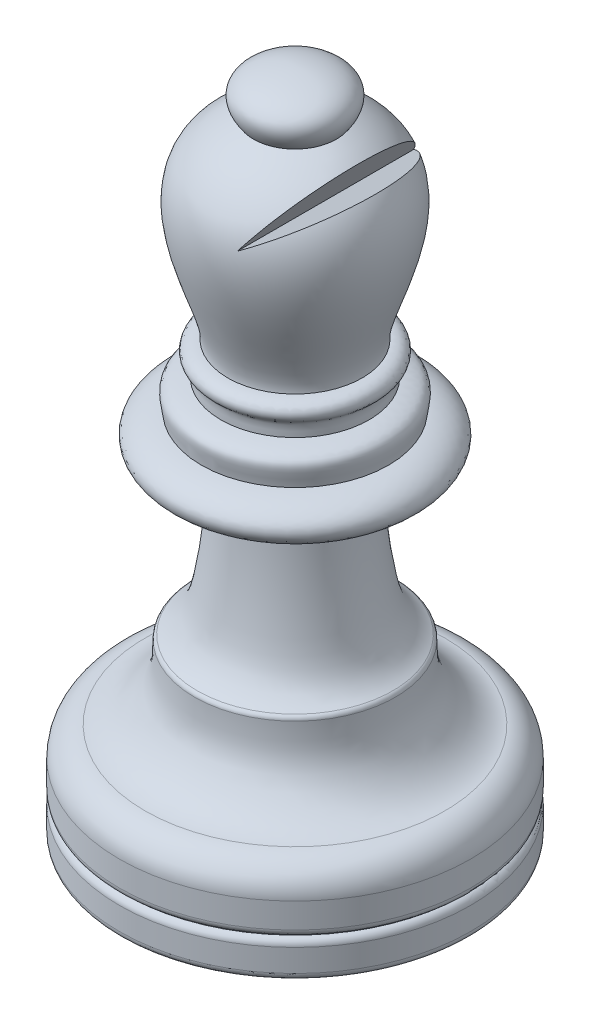
ISO-10303-21;
HEADER;
FILE_DESCRIPTION(('STEP AP214'),'2;1');
FILE_NAME('part.step','',(''),(''),'','','');
FILE_SCHEMA(('AUTOMOTIVE_DESIGN { 1 0 10303 214 1 1 1 1 }'));
ENDSEC;
DATA;
#1=APPLICATION_CONTEXT('core data for automotive mechanical design processes');
#2=APPLICATION_PROTOCOL_DEFINITION('international standard','automotive_design',2000,#1);
#3=PRODUCT_CONTEXT('',#1,'mechanical');
#4=PRODUCT('Part','Part','',(#3));
#5=PRODUCT_RELATED_PRODUCT_CATEGORY('part','',(#4));
#6=PRODUCT_DEFINITION_FORMATION('','',#4);
#7=PRODUCT_DEFINITION_CONTEXT('part definition',#1,'design');
#8=PRODUCT_DEFINITION('design','',#6,#7);
#9=PRODUCT_DEFINITION_SHAPE('','',#8);
#10=(LENGTH_UNIT() NAMED_UNIT(*) SI_UNIT(.MILLI.,.METRE.));
#11=(NAMED_UNIT(*) PLANE_ANGLE_UNIT() SI_UNIT($,.RADIAN.));
#12=(NAMED_UNIT(*) SI_UNIT($,.STERADIAN.) SOLID_ANGLE_UNIT());
#13=UNCERTAINTY_MEASURE_WITH_UNIT(LENGTH_MEASURE(1.E-05),#10,'distance_accuracy_value','');
#14=(GEOMETRIC_REPRESENTATION_CONTEXT(3) GLOBAL_UNCERTAINTY_ASSIGNED_CONTEXT((#13)) GLOBAL_UNIT_ASSIGNED_CONTEXT((#10,
#11,#12)) REPRESENTATION_CONTEXT('',''));
#15=CARTESIAN_POINT('',(0.,0.,0.));
#16=DIRECTION('',(0.,0.,1.));
#17=DIRECTION('',(1.,0.,0.));
#18=AXIS2_PLACEMENT_3D('',#15,#16,#17);
#19=CARTESIAN_POINT('',(0.,0.,0.));
#20=DIRECTION('',(0.,1.,0.));
#21=DIRECTION('',(0.,0.,1.));
#22=AXIS2_PLACEMENT_3D('',#19,#20,#21);
#23=PLANE('',#22);
#24=CARTESIAN_POINT('',(0.,0.,0.));
#25=DIRECTION('',(0.,-1.,0.));
#26=DIRECTION('',(0.,0.,-1.));
#27=AXIS2_PLACEMENT_3D('',#24,#25,#26);
#28=CIRCLE('',#27,17.018);
#29=CARTESIAN_POINT('',(0.,0.,-17.018));
#30=VERTEX_POINT('',#29);
#31=EDGE_CURVE('E61',#30,#30,#28,.T.);
#32=ORIENTED_EDGE('',*,*,#31,.T.);
#33=EDGE_LOOP('',(#32));
#34=FACE_BOUND('',#33,.T.);
#35=ADVANCED_FACE('F34',(#34),#23,.F.);
#36=CARTESIAN_POINT('',(0.,0.761999999999975,0.));
#37=DIRECTION('',(0.,-1.,0.));
#38=DIRECTION('',(0.,0.,-1.));
#39=AXIS2_PLACEMENT_3D('',#36,#37,#38);
#40=TOROIDAL_SURFACE('',#39,17.018,0.762000000000006);
#41=ORIENTED_EDGE('',*,*,#31,.F.);
#42=EDGE_LOOP('',(#41));
#43=FACE_BOUND('',#42,.T.);
#44=CARTESIAN_POINT('',(0.,0.761999999999975,0.));
#45=DIRECTION('',(0.,-1.,0.));
#46=DIRECTION('',(0.,0.,-1.));
#47=AXIS2_PLACEMENT_3D('',#44,#45,#46);
#48=CIRCLE('',#47,17.78);
#49=CARTESIAN_POINT('',(0.,0.761999999999975,-17.78));
#50=VERTEX_POINT('',#49);
#51=EDGE_CURVE('E115',#50,#50,#48,.T.);
#52=ORIENTED_EDGE('',*,*,#51,.T.);
#53=EDGE_LOOP('',(#52));
#54=FACE_BOUND('',#53,.T.);
#55=ADVANCED_FACE('F217',(#43,#54),#40,.T.);
#56=CARTESIAN_POINT('',(0.,0.,0.));
#57=DIRECTION('',(0.,-1.,0.));
#58=DIRECTION('',(0.,0.,-1.));
#59=AXIS2_PLACEMENT_3D('',#56,#57,#58);
#60=CYLINDRICAL_SURFACE('',#59,17.78);
#61=ORIENTED_EDGE('',*,*,#51,.F.);
#62=EDGE_LOOP('',(#61));
#63=FACE_BOUND('',#62,.T.);
#64=CARTESIAN_POINT('',(0.,3.048,0.));
#65=DIRECTION('',(0.,-1.,0.));
#66=DIRECTION('',(0.,0.,-1.));
#67=AXIS2_PLACEMENT_3D('',#64,#65,#66);
#68=CIRCLE('',#67,17.78);
#69=CARTESIAN_POINT('',(0.,3.048,-17.78));
#70=VERTEX_POINT('',#69);
#71=EDGE_CURVE('E112',#70,#70,#68,.T.);
#72=ORIENTED_EDGE('',*,*,#71,.T.);
#73=EDGE_LOOP('',(#72));
#74=FACE_BOUND('',#73,.T.);
#75=ADVANCED_FACE('F214',(#63,#74),#60,.T.);
#76=CARTESIAN_POINT('',(0.,3.048,0.));
#77=DIRECTION('',(0.,-1.,0.));
#78=DIRECTION('',(0.,0.,-1.));
#79=AXIS2_PLACEMENT_3D('',#76,#77,#78);
#80=TOROIDAL_SURFACE('',#79,17.018,0.762000000000006);
#81=ORIENTED_EDGE('',*,*,#71,.F.);
#82=EDGE_LOOP('',(#81));
#83=FACE_BOUND('',#82,.T.);
#84=CARTESIAN_POINT('',(0.,3.76642048968553,0.));
#85=DIRECTION('',(0.,-1.,0.));
#86=DIRECTION('',(0.,0.,-1.));
#87=AXIS2_PLACEMENT_3D('',#84,#85,#86);
#88=CIRCLE('',#87,17.272);
#89=CARTESIAN_POINT('',(0.,3.76642048968553,-17.272));
#90=VERTEX_POINT('',#89);
#91=EDGE_CURVE('E109',#90,#90,#88,.T.);
#92=ORIENTED_EDGE('',*,*,#91,.T.);
#93=EDGE_LOOP('',(#92));
#94=FACE_BOUND('',#93,.T.);
#95=ADVANCED_FACE('F210',(#83,#94),#80,.T.);
#96=CARTESIAN_POINT('',(0.,0.,0.));
#97=DIRECTION('',(0.,-1.,0.));
#98=DIRECTION('',(0.,0.,-1.));
#99=AXIS2_PLACEMENT_3D('',#96,#97,#98);
#100=CYLINDRICAL_SURFACE('',#99,17.272);
#101=ORIENTED_EDGE('',*,*,#91,.F.);
#102=EDGE_LOOP('',(#101));
#103=FACE_BOUND('',#102,.T.);
#104=CARTESIAN_POINT('',(0.,3.85357951031446,0.));
#105=DIRECTION('',(0.,-1.,0.));
#106=DIRECTION('',(0.,0.,-1.));
#107=AXIS2_PLACEMENT_3D('',#104,#105,#106);
#108=CIRCLE('',#107,17.272);
#109=CARTESIAN_POINT('',(0.,3.85357951031446,-17.272));
#110=VERTEX_POINT('',#109);
#111=EDGE_CURVE('E106',#110,#110,#108,.T.);
#112=ORIENTED_EDGE('',*,*,#111,.T.);
#113=EDGE_LOOP('',(#112));
#114=FACE_BOUND('',#113,.T.);
#115=ADVANCED_FACE('F206',(#103,#114),#100,.T.);
#116=CARTESIAN_POINT('',(0.,4.572,0.));
#117=DIRECTION('',(0.,-1.,0.));
#118=DIRECTION('',(0.,0.,-1.));
#119=AXIS2_PLACEMENT_3D('',#116,#117,#118);
#120=TOROIDAL_SURFACE('',#119,17.018,0.762000000000006);
#121=ORIENTED_EDGE('',*,*,#111,.F.);
#122=EDGE_LOOP('',(#121));
#123=FACE_BOUND('',#122,.T.);
#124=CARTESIAN_POINT('',(0.,4.572,0.));
#125=DIRECTION('',(0.,-1.,0.));
#126=DIRECTION('',(0.,0.,-1.));
#127=AXIS2_PLACEMENT_3D('',#124,#125,#126);
#128=CIRCLE('',#127,17.78);
#129=CARTESIAN_POINT('',(0.,4.572,-17.78));
#130=VERTEX_POINT('',#129);
#131=EDGE_CURVE('E103',#130,#130,#128,.T.);
#132=ORIENTED_EDGE('',*,*,#131,.T.);
#133=EDGE_LOOP('',(#132));
#134=FACE_BOUND('',#133,.T.);
#135=ADVANCED_FACE('F202',(#123,#134),#120,.T.);
#136=CARTESIAN_POINT('',(0.,0.,0.));
#137=DIRECTION('',(0.,-1.,0.));
#138=DIRECTION('',(0.,0.,-1.));
#139=AXIS2_PLACEMENT_3D('',#136,#137,#138);
#140=CYLINDRICAL_SURFACE('',#139,17.78);
#141=ORIENTED_EDGE('',*,*,#131,.F.);
#142=EDGE_LOOP('',(#141));
#143=FACE_BOUND('',#142,.T.);
#144=CARTESIAN_POINT('',(0.,7.112,0.));
#145=DIRECTION('',(0.,-1.,0.));
#146=DIRECTION('',(0.,0.,-1.));
#147=AXIS2_PLACEMENT_3D('',#144,#145,#146);
#148=CIRCLE('',#147,17.78);
#149=CARTESIAN_POINT('',(0.,7.112,-17.78));
#150=VERTEX_POINT('',#149);
#151=EDGE_CURVE('E100',#150,#150,#148,.T.);
#152=ORIENTED_EDGE('',*,*,#151,.T.);
#153=EDGE_LOOP('',(#152));
#154=FACE_BOUND('',#153,.T.);
#155=ADVANCED_FACE('F198',(#143,#154),#140,.T.);
#156=CARTESIAN_POINT('',(0.,7.112,0.));
#157=DIRECTION('',(0.,-1.,0.));
#158=DIRECTION('',(0.,0.,-1.));
#159=AXIS2_PLACEMENT_3D('',#156,#157,#158);
#160=TOROIDAL_SURFACE('',#159,14.8377650975335,2.94223490246648);
#161=ORIENTED_EDGE('',*,*,#151,.F.);
#162=EDGE_LOOP('',(#161));
#163=FACE_BOUND('',#162,.T.);
#164=CARTESIAN_POINT('',(0.,10.0349260723206,0.));
#165=DIRECTION('',(0.,1.,0.));
#166=DIRECTION('',(0.,0.,1.));
#167=AXIS2_PLACEMENT_3D('',#164,#165,#166);
#168=CIRCLE('',#167,15.1742905750839);
#169=CARTESIAN_POINT('',(0.,10.0349260723206,15.1742905750839));
#170=VERTEX_POINT('',#169);
#171=EDGE_CURVE('E64',#170,#170,#168,.T.);
#172=ORIENTED_EDGE('',*,*,#171,.F.);
#173=EDGE_LOOP('',(#172));
#174=FACE_BOUND('',#173,.T.);
#175=ADVANCED_FACE('F194',(#163,#174),#160,.T.);
#176=CARTESIAN_POINT('',(-10.1658072062689,17.5050188004564,0.));
#177=CARTESIAN_POINT('',(-10.1809672803453,15.59489943262,0.));
#178=CARTESIAN_POINT('',(-10.3592727653847,13.0901704590535,0.));
#179=CARTESIAN_POINT('',(-13.3160882163974,10.2488666307438,0.));
#180=CARTESIAN_POINT('',(-15.1742905750839,10.0349260723206,0.));
#181=B_SPLINE_CURVE_WITH_KNOTS('',3,(#176,#177,#178,#179,#180),.UNSPECIFIED.,.F.,.F.,(4,1,4),
(0.,0.437710418900928,0.976644515068052),.UNSPECIFIED.);
#182=CARTESIAN_POINT('',(0.,67.6698781179495,0.));
#183=DIRECTION('',(0.,1.,0.));
#184=AXIS1_PLACEMENT('',#182,#183);
#185=SURFACE_OF_REVOLUTION('',#181,#184);
#186=ORIENTED_EDGE('',*,*,#171,.T.);
#187=EDGE_LOOP('',(#186));
#188=FACE_BOUND('',#187,.T.);
#189=CARTESIAN_POINT('',(0.,17.5050188004564,0.));
#190=DIRECTION('',(0.,1.,0.));
#191=DIRECTION('',(0.,0.,1.));
#192=AXIS2_PLACEMENT_3D('',#189,#190,#191);
#193=CIRCLE('',#192,10.1658072062689);
#194=CARTESIAN_POINT('',(0.,17.5050188004564,10.1658072062689));
#195=VERTEX_POINT('',#194);
#196=EDGE_CURVE('E97',#195,#195,#193,.T.);
#197=ORIENTED_EDGE('',*,*,#196,.F.);
#198=EDGE_LOOP('',(#197));
#199=FACE_BOUND('',#198,.T.);
#200=ADVANCED_FACE('F190',(#188,#199),#185,.F.);
#201=CARTESIAN_POINT('',(0.,17.5009870759405,0.));
#202=DIRECTION('',(0.,1.,0.));
#203=DIRECTION('',(0.,0.,1.));
#204=AXIS2_PLACEMENT_3D('',#201,#202,#203);
#205=TOROIDAL_SURFACE('',#204,9.65782320534226,0.508);
#206=ORIENTED_EDGE('',*,*,#196,.T.);
#207=EDGE_LOOP('',(#206));
#208=FACE_BOUND('',#207,.T.);
#209=CARTESIAN_POINT('',(0.,17.9425825955284,0.));
#210=DIRECTION('',(0.,1.,0.));
#211=DIRECTION('',(0.,0.,1.));
#212=AXIS2_PLACEMENT_3D('',#209,#210,#211);
#213=CIRCLE('',#212,9.90893552499204);
#214=CARTESIAN_POINT('',(0.,17.9425825955284,9.90893552499204));
#215=VERTEX_POINT('',#214);
#216=EDGE_CURVE('E94',#215,#215,#213,.T.);
#217=ORIENTED_EDGE('',*,*,#216,.F.);
#218=EDGE_LOOP('',(#217));
#219=FACE_BOUND('',#218,.T.);
#220=ADVANCED_FACE('F186',(#208,#219),#205,.T.);
#221=CARTESIAN_POINT('',(-6.33561093892401,32.8495308731566,0.));
#222=CARTESIAN_POINT('',(-6.335610938924,28.9384637251122,0.));
#223=CARTESIAN_POINT('',(-7.20170632713195,22.0084679292815,0.));
#224=CARTESIAN_POINT('',(-8.18723618731335,18.9216231320525,0.));
#225=CARTESIAN_POINT('',(-9.90893552499204,17.9425825955284,0.));
#226=B_SPLINE_CURVE_WITH_KNOTS('',3,(#221,#222,#223,#224,#225),.UNSPECIFIED.,.F.,.F.,(4,1,4),
(0.0340636564472049,0.517031828223599,1.),.UNSPECIFIED.);
#227=CARTESIAN_POINT('',(0.,67.6698781179495,0.));
#228=DIRECTION('',(0.,1.,0.));
#229=AXIS1_PLACEMENT('',#227,#228);
#230=SURFACE_OF_REVOLUTION('',#226,#229);
#231=ORIENTED_EDGE('',*,*,#216,.T.);
#232=EDGE_LOOP('',(#231));
#233=FACE_BOUND('',#232,.T.);
#234=CARTESIAN_POINT('',(0.,32.8495308731565,0.));
#235=DIRECTION('',(0.,1.,0.));
#236=DIRECTION('',(0.,0.,1.));
#237=AXIS2_PLACEMENT_3D('',#234,#235,#236);
#238=CIRCLE('',#237,6.33561093892401);
#239=CARTESIAN_POINT('',(0.,32.8495308731565,6.33561093892401));
#240=VERTEX_POINT('',#239);
#241=EDGE_CURVE('E91',#240,#240,#238,.T.);
#242=ORIENTED_EDGE('',*,*,#241,.F.);
#243=EDGE_LOOP('',(#242));
#244=FACE_BOUND('',#243,.T.);
#245=ADVANCED_FACE('F170',(#233,#244),#230,.F.);
#246=CARTESIAN_POINT('',(-9.47679987893514,37.5095441929416,0.));
#247=CARTESIAN_POINT('',(-13.5515715372785,37.1082659605497,0.));
#248=CARTESIAN_POINT('',(-14.7005135325093,33.3538368824988,0.));
#249=CARTESIAN_POINT('',(-6.33561093892401,32.8495308731565,0.));
#250=B_SPLINE_CURVE_WITH_KNOTS('',3,(#246,#247,#248,#249),.UNSPECIFIED.,.F.,.F.,(4,4),(0.,1.),.UNSPECIFIED.);
#251=CARTESIAN_POINT('',(0.,67.6698781179495,0.));
#252=DIRECTION('',(0.,1.,0.));
#253=AXIS1_PLACEMENT('',#251,#252);
#254=SURFACE_OF_REVOLUTION('',#250,#253);
#255=ORIENTED_EDGE('',*,*,#241,.T.);
#256=EDGE_LOOP('',(#255));
#257=FACE_BOUND('',#256,.T.);
#258=CARTESIAN_POINT('',(0.,37.5095441929416,0.));
#259=DIRECTION('',(0.,1.,0.));
#260=DIRECTION('',(0.,0.,1.));
#261=AXIS2_PLACEMENT_3D('',#258,#259,#260);
#262=CIRCLE('',#261,9.47679987893517);
#263=CARTESIAN_POINT('',(0.,37.5095441929416,9.47679987893517));
#264=VERTEX_POINT('',#263);
#265=EDGE_CURVE('E88',#264,#264,#262,.T.);
#266=ORIENTED_EDGE('',*,*,#265,.F.);
#267=EDGE_LOOP('',(#266));
#268=FACE_BOUND('',#267,.T.);
#269=ADVANCED_FACE('F166',(#257,#268),#254,.F.);
#270=CARTESIAN_POINT('',(-7.50256352380719,40.495892352194,0.));
#271=CARTESIAN_POINT('',(-10.409099173475,40.1261014526597,0.));
#272=CARTESIAN_POINT('',(-9.65886315654239,39.31118182096,0.));
#273=CARTESIAN_POINT('',(-9.47679987893517,37.5095441929416,0.));
#274=B_SPLINE_CURVE_WITH_KNOTS('',3,(#270,#271,#272,#273),.UNSPECIFIED.,.F.,.F.,(4,4),(0.,1.),.UNSPECIFIED.);
#275=CARTESIAN_POINT('',(0.,67.6698781179495,0.));
#276=DIRECTION('',(0.,1.,0.));
#277=AXIS1_PLACEMENT('',#275,#276);
#278=SURFACE_OF_REVOLUTION('',#274,#277);
#279=ORIENTED_EDGE('',*,*,#265,.T.);
#280=EDGE_LOOP('',(#279));
#281=FACE_BOUND('',#280,.T.);
#282=CARTESIAN_POINT('',(0.,40.495892352194,0.));
#283=DIRECTION('',(0.,1.,0.));
#284=DIRECTION('',(0.,0.,1.));
#285=AXIS2_PLACEMENT_3D('',#282,#283,#284);
#286=CIRCLE('',#285,7.50256352380719);
#287=CARTESIAN_POINT('',(0.,40.495892352194,7.50256352380719));
#288=VERTEX_POINT('',#287);
#289=EDGE_CURVE('E80',#288,#288,#286,.T.);
#290=ORIENTED_EDGE('',*,*,#289,.F.);
#291=EDGE_LOOP('',(#290));
#292=FACE_BOUND('',#291,.T.);
#293=ADVANCED_FACE('F162',(#281,#292),#278,.F.);
#294=CARTESIAN_POINT('',(-6.80398712890876,43.8222789138501,0.));
#295=CARTESIAN_POINT('',(-8.34292458633681,43.8222789138501,0.));
#296=CARTESIAN_POINT('',(-8.57815167741565,42.5722983479072,0.));
#297=CARTESIAN_POINT('',(-7.45016531967225,41.873203308927,0.));
#298=CARTESIAN_POINT('',(-7.50256352380719,41.2489996545864,0.));
#299=CARTESIAN_POINT('',(-7.50256352380719,40.495892352194,0.));
#300=B_SPLINE_CURVE_WITH_KNOTS('',3,(#294,#295,#296,#297,#298,#299),.UNSPECIFIED.,.F.,.F.,(4,1,
1,4),(0.,0.575411721932043,0.675411721932043,1.),.UNSPECIFIED.);
#301=CARTESIAN_POINT('',(0.,67.6698781179495,0.));
#302=DIRECTION('',(0.,1.,0.));
#303=AXIS1_PLACEMENT('',#301,#302);
#304=SURFACE_OF_REVOLUTION('',#300,#303);
#305=ORIENTED_EDGE('',*,*,#289,.T.);
#306=EDGE_LOOP('',(#305));
#307=FACE_BOUND('',#306,.T.);
#308=CARTESIAN_POINT('',(0.,43.8222789138501,0.));
#309=DIRECTION('',(0.,1.,0.));
#310=DIRECTION('',(0.,0.,1.));
#311=AXIS2_PLACEMENT_3D('',#308,#309,#310);
#312=CIRCLE('',#311,6.80398712890876);
#313=CARTESIAN_POINT('',(0.,43.8222789138501,6.80398712890876));
#314=VERTEX_POINT('',#313);
#315=EDGE_CURVE('E74',#314,#314,#312,.T.);
#316=ORIENTED_EDGE('',*,*,#315,.F.);
#317=EDGE_LOOP('',(#316));
#318=FACE_BOUND('',#317,.T.);
#319=ADVANCED_FACE('F70',(#307,#318),#304,.F.);
#320=CARTESIAN_POINT('',(-4.20185587861461,63.4648150169811,0.));
#321=CARTESIAN_POINT('',(-14.9075575344491,58.9286477823746,0.));
#322=CARTESIAN_POINT('',(-6.28085600979704,47.5213361669619,0.));
#323=CARTESIAN_POINT('',(-6.80398712890876,43.8222789138501,0.));
#324=B_SPLINE_CURVE_WITH_KNOTS('',3,(#320,#321,#322,#323),.UNSPECIFIED.,.F.,.F.,(4,4),(0.,1.),.UNSPECIFIED.);
#325=CARTESIAN_POINT('',(0.,67.6698781179495,0.));
#326=DIRECTION('',(0.,1.,0.));
#327=AXIS1_PLACEMENT('',#325,#326);
#328=SURFACE_OF_REVOLUTION('',#324,#327);
#329=CARTESIAN_POINT('',(3.09599411827797,57.5573296947912,8.9388490998024));
#330=CARTESIAN_POINT('',(3.24978801906795,57.6502305790248,8.86807176976207));
#331=CARTESIAN_POINT('',(3.40166705936675,57.7419747708804,8.79160569343443));
#332=CARTESIAN_POINT('',(3.7009739986164,57.9227743940819,8.6275769313474));
#333=CARTESIAN_POINT('',(3.84840177817235,58.0118297533061,8.54001394826565));
#334=CARTESIAN_POINT('',(4.13817724978761,58.1868717894595,8.35407557641473));
#335=CARTESIAN_POINT('',(4.2805249143436,58.272858449775,8.25570012911952));
#336=CARTESIAN_POINT('',(4.55899185220129,58.4410694426941,8.0489283588191));
#337=CARTESIAN_POINT('',(4.69513355899365,58.5233073264926,7.94057326391947));
#338=CARTESIAN_POINT('',(4.96122382212537,58.6840420539681,7.71396181201206));
#339=CARTESIAN_POINT('',(5.09117291415201,58.7625392212329,7.59570631387956));
#340=CARTESIAN_POINT('',(5.3443567969643,58.91547770882,7.34981746554812));
#341=CARTESIAN_POINT('',(5.46759251867344,58.9899195914768,7.22218542136168));
#342=CARTESIAN_POINT('',(5.74615210680223,59.1581865508033,6.91477117778077));
#343=CARTESIAN_POINT('',(5.89875612539199,59.2503686737078,6.73160619716693));
#344=CARTESIAN_POINT('',(6.19042138648552,59.4265522578201,6.35109193585592));
#345=CARTESIAN_POINT('',(6.32948072087358,59.5105525664099,6.15374066344273));
#346=CARTESIAN_POINT('',(6.59326700698449,59.669895551421,5.74639081289797));
#347=CARTESIAN_POINT('',(6.71799471310848,59.7452386835467,5.53639290135928));
#348=CARTESIAN_POINT('',(6.9525080339383,59.8868990144033,5.10530589248278));
#349=CARTESIAN_POINT('',(7.06229315350929,59.9532159140426,4.88421642794934));
#350=CARTESIAN_POINT('',(7.26907710854067,60.0781260188585,4.42669526147947));
#351=CARTESIAN_POINT('',(7.36567270131773,60.1364756408914,4.19001483633924));
#352=CARTESIAN_POINT('',(7.54227550064466,60.2431544892158,3.70827230708183));
#353=CARTESIAN_POINT('',(7.62227704770012,60.2914802968279,3.46320737646863));
#354=CARTESIAN_POINT('',(7.76537449565557,60.3779198719889,2.96641609751791));
#355=CARTESIAN_POINT('',(7.82847007585708,60.4160334458162,2.71468962291344));
#356=CARTESIAN_POINT('',(7.937576009894,60.4819400760212,2.20619726649259));
#357=CARTESIAN_POINT('',(7.98357978492897,60.5097291584027,1.94942948418207));
#358=CARTESIAN_POINT('',(8.09997438800318,60.5800385886861,1.1444133113384));
#359=CARTESIAN_POINT('',(8.1405044447068,60.6045212117711,0.589878661083574));
#360=CARTESIAN_POINT('',(8.14379127243938,60.6065066559344,-0.519628074600037));
#361=CARTESIAN_POINT('',(8.10652718035503,60.5839968744215,-1.0746002374631));
#362=CARTESIAN_POINT('',(7.99166318000055,60.5146120214155,-1.90396230868258));
#363=CARTESIAN_POINT('',(7.94234882417061,60.4848231465741,-2.18403526342709));
#364=CARTESIAN_POINT('',(7.82340977176324,60.4129767139016,-2.738191390318));
#365=CARTESIAN_POINT('',(7.75379302949472,60.3709239609577,-3.01227686319044));
#366=CARTESIAN_POINT('',(7.59448871349209,60.2746944502759,-3.55241087585767));
#367=CARTESIAN_POINT('',(7.50479778667275,60.2205156670703,-3.81845806454404));
#368=CARTESIAN_POINT('',(7.30577290988534,60.1002925181479,-4.34020371940926));
#369=CARTESIAN_POINT('',(7.19644790479969,60.034253555685,-4.59590683340816));
#370=CARTESIAN_POINT('',(6.96180068689767,59.8925123428407,-5.08830187138104));
#371=CARTESIAN_POINT('',(6.83697575062029,59.8171104777797,-5.32531715990702));
#372=CARTESIAN_POINT('',(6.56985812510782,59.6557551608458,-5.78552862554353));
#373=CARTESIAN_POINT('',(6.4275653650952,59.5698016662189,-6.00872474665492));
#374=CARTESIAN_POINT('',(6.12644567462928,59.3879070308613,-6.43921447518004));
#375=CARTESIAN_POINT('',(5.9676245820768,59.2919694165783,-6.64651365285293));
#376=CARTESIAN_POINT('',(5.63451731195171,59.0907523346246,-7.04337836274786));
#377=CARTESIAN_POINT('',(5.46023279122337,58.9854738677887,-7.23294579039542));
#378=CARTESIAN_POINT('',(5.11665617955845,58.7779326658185,-7.57365505833842));
#379=CARTESIAN_POINT('',(4.94877309140983,58.6765210541957,-7.72674106642203));
#380=CARTESIAN_POINT('',(4.60280019827762,58.4675323522529,-8.01625220350759));
#381=CARTESIAN_POINT('',(4.42471106670023,58.3599556687113,-8.15267842988525));
#382=CARTESIAN_POINT('',(4.05925701265125,58.139199158905,-8.4081439187394));
#383=CARTESIAN_POINT('',(3.87187842500059,58.0260110780399,-8.52715648382024));
#384=CARTESIAN_POINT('',(3.48939580390992,57.7949682764674,-8.74689252828659));
#385=CARTESIAN_POINT('',(3.29429091901319,57.6771130414282,-8.84761398507735));
#386=CARTESIAN_POINT('',(3.09599411827797,57.5573296947912,-8.9388490998024));
#387=B_SPLINE_CURVE_WITH_KNOTS('',3,(#329,#330,#331,#332,#333,#334,#335,#336,#337,#338,#339,
#340,#341,#342,#343,#344,#345,#346,#347,#348,#349,#350,#351,#352,#353,#354,#355,#356,#357,#358,
#359,#360,#361,#362,#363,#364,#365,#366,#367,#368,#369,#370,#371,#372,#373,#374,#375,#376,#377,
#378,#379,#380,#381,#382,#383,#384,#385,#386),.UNSPECIFIED.,.F.,.F.,(4,2,2,2,2,2,2,2,2,2,2,2,2,
2,2,2,2,2,2,2,2,2,2,2,2,2,2,2,4),(0.,0.579247759899587,1.15851104302,1.73777746174875,
2.31474983778154,2.89167221233197,3.46851438202892,4.23440174392363,5.00039684509118,
5.76635160662945,6.53233174252966,7.31808575498915,8.10410731431068,8.89014378304733,
9.67648249211188,11.3381725011016,13.0003082053135,13.8572377201065,14.7138319469417,
15.5705693616537,16.4269174499789,17.2607069334198,18.0944997953869,18.9279991501271,
19.7614093063556,20.5070029685803,21.2525474922132,21.999223317456,22.7459816584332),.UNSPECIFIED.);
#388=CARTESIAN_POINT('',(3.09599411827798,57.5573296947912,8.9388490998024));
#389=VERTEX_POINT('',#388);
#390=CARTESIAN_POINT('',(3.09599411827798,57.5573296947912,-8.9388490998024));
#391=VERTEX_POINT('',#390);
#392=EDGE_CURVE('E11',#389,#391,#387,.T.);
#393=ORIENTED_EDGE('',*,*,#392,.F.);
#394=CARTESIAN_POINT('',(3.09599411827798,57.5573296947912,-8.9388490998024));
#395=CARTESIAN_POINT('',(3.17570663552324,57.6747687469159,-8.88909934927361));
#396=CARTESIAN_POINT('',(3.2546757848356,57.7911126081166,-8.83553983333954));
#397=CARTESIAN_POINT('',(3.41086702421626,58.0212264188072,-8.72079383714927));
#398=CARTESIAN_POINT('',(3.48808870475527,58.1349957649448,-8.65960559048589));
#399=CARTESIAN_POINT('',(3.64048947843021,58.3595251490613,-8.52961604875431));
#400=CARTESIAN_POINT('',(3.71566851691133,58.4702851065182,-8.46081455022826));
#401=CARTESIAN_POINT('',(3.86338928996013,58.6879195278802,-8.3160230605161));
#402=CARTESIAN_POINT('',(3.93594098693793,58.7948086692292,-8.24006529914816));
#403=CARTESIAN_POINT('',(4.07848439339818,59.0048153672966,-8.0809042792476));
#404=CARTESIAN_POINT('',(4.14847637395592,59.1079333233854,-7.99770179110876));
#405=CARTESIAN_POINT('',(4.28566712268748,59.3100540447991,-7.82432237460944));
#406=CARTESIAN_POINT('',(4.35286607398982,59.4090570799239,-7.73414590461949));
#407=CARTESIAN_POINT('',(4.51725433099357,59.6512474127615,-7.50019451387869));
#408=CARTESIAN_POINT('',(4.612576083466,59.7916832770911,-7.35222647900669));
#409=CARTESIAN_POINT('',(4.79593156098748,60.0618176829052,-7.0425877788952));
#410=CARTESIAN_POINT('',(4.88396371519342,60.1915139100941,-6.88091417534006));
#411=CARTESIAN_POINT('',(5.05239744955327,60.439664373693,-6.54531337426832));
#412=CARTESIAN_POINT('',(5.13279580456908,60.5581138585636,-6.37138105126222));
#413=CARTESIAN_POINT('',(5.2857109138334,60.7834010042736,-6.0128811459237));
#414=CARTESIAN_POINT('',(5.35822753569427,60.8902384700687,-5.82831338502996));
#415=CARTESIAN_POINT('',(5.49780985023145,61.0958826433944,-5.44312898428323));
#416=CARTESIAN_POINT('',(5.56457908023049,61.1942525776678,-5.2421722379773));
#417=CARTESIAN_POINT('',(5.68958037792658,61.3784147948842,-4.8320041881401));
#418=CARTESIAN_POINT('',(5.74781135084535,61.4642054649096,-4.62279183042848));
#419=CARTESIAN_POINT('',(5.85582079601119,61.6233338841234,-4.19742796777341));
#420=CARTESIAN_POINT('',(5.90559474793436,61.696664973598,-3.98127282480508));
#421=CARTESIAN_POINT('',(5.99671939745381,61.8309173198365,-3.54347198808561));
#422=CARTESIAN_POINT('',(6.03807014247982,61.8918386464779,-3.32182632525861));
#423=CARTESIAN_POINT('',(6.16267396702618,62.0754152734813,-2.57156079519234));
#424=CARTESIAN_POINT('',(6.22710166830506,62.1703354746021,-2.03260786507419));
#425=CARTESIAN_POINT('',(6.31015032923769,62.2926896086479,-0.943901076639308));
#426=CARTESIAN_POINT('',(6.32874881009024,62.3200904239498,-0.394142051232828));
#427=CARTESIAN_POINT('',(6.31957015363265,62.3065676705428,0.769686573299424));
#428=CARTESIAN_POINT('',(6.28605932907927,62.2571967610863,1.38368688205943));
#429=CARTESIAN_POINT('',(6.19281612318836,62.1198231829416,2.29010208769147));
#430=CARTESIAN_POINT('',(6.15453948411684,62.0634308826302,2.58996976506637));
#431=CARTESIAN_POINT('',(6.06358450180166,61.9294285041047,3.18263793489858));
#432=CARTESIAN_POINT('',(6.01090875947206,61.8518222577718,3.47543969328996));
#433=CARTESIAN_POINT('',(5.85038567667071,61.6153264182248,4.24628629358036));
#434=CARTESIAN_POINT('',(5.72929321506893,61.4369230205978,4.71602408234874));
#435=CARTESIAN_POINT('',(5.5166597706291,61.1236539001635,5.38870798984555));
#436=CARTESIAN_POINT('',(5.44062786171081,61.0116374236655,5.60758955889996));
#437=CARTESIAN_POINT('',(5.27817060016674,60.7722919925357,6.03288044543706));
#438=CARTESIAN_POINT('',(5.19174544173924,60.6449633240128,6.23928999585168));
#439=CARTESIAN_POINT('',(5.00794227116388,60.3741693398827,6.63892343060915));
#440=CARTESIAN_POINT('',(4.91047916765774,60.2305786606713,6.83202341606061));
#441=CARTESIAN_POINT('',(4.70562142130281,59.9287653397057,7.20080695038504));
#442=CARTESIAN_POINT('',(4.59822596106099,59.7705414937005,7.37648906336757));
#443=CARTESIAN_POINT('',(4.37436273357908,59.4407277310745,7.70811024701776));
#444=CARTESIAN_POINT('',(4.25790277086918,59.2691493127309,7.86406600485486));
#445=CARTESIAN_POINT('',(4.01694665098395,58.9141528918314,8.15462669732571));
#446=CARTESIAN_POINT('',(3.89245454726357,58.7307408611594,8.28924228461138));
#447=CARTESIAN_POINT('',(3.65724258546387,58.3842072075156,8.51630483868113));
#448=CARTESIAN_POINT('',(3.54752362552415,58.2225601901997,8.61205195916544));
#449=CARTESIAN_POINT('',(3.38011937652194,57.9759264493033,8.74361903622537));
#450=CARTESIAN_POINT('',(3.32389872218241,57.8930975463451,8.78543365039975));
#451=CARTESIAN_POINT('',(3.21058072739342,57.726148134175,8.86510468340814));
#452=CARTESIAN_POINT('',(3.15348340521708,57.6420276518847,8.90296118461634));
#453=CARTESIAN_POINT('',(3.09599411827797,57.5573296947912,8.93884909980241));
#454=B_SPLINE_CURVE_WITH_KNOTS('',3,(#394,#395,#396,#397,#398,#399,#400,#401,#402,#403,#404,
#405,#406,#407,#408,#409,#410,#411,#412,#413,#414,#415,#416,#417,#418,#419,#420,#421,#422,#423,
#424,#425,#426,#427,#428,#429,#430,#431,#432,#433,#434,#435,#436,#437,#438,#439,#440,#441,#442,
#443,#444,#445,#446,#447,#448,#449,#450,#451,#452,#453),.UNSPECIFIED.,.F.,.F.,(4,2,2,2,2,2,2,2,
2,2,2,2,2,2,2,2,2,2,2,2,2,2,2,2,2,2,2,2,2,4),(0.,0.451171536926379,0.902447735811775,
1.35373599759366,1.803080984488,2.25237824690343,2.70164600395278,3.37630591971427,
4.05111084234123,4.72619960065174,5.40129969651976,6.10109705373364,6.80098406089044,
7.50124399260121,8.20149998115008,9.84742071872026,11.4941486043652,13.3352682004597,
14.2568375175108,15.1782404811089,16.7213198142187,17.4926623260276,18.2639904275099,
19.0417316153827,19.8195368652806,20.5966796800947,21.3734333284277,22.0253877447553,
22.3507812965299,22.6761680750333),.UNSPECIFIED.);
#455=EDGE_CURVE('E46',#391,#389,#454,.T.);
#456=ORIENTED_EDGE('',*,*,#455,.F.);
#457=EDGE_LOOP('',(#393,#456));
#458=FACE_BOUND('',#457,.T.);
#459=ORIENTED_EDGE('',*,*,#315,.T.);
#460=EDGE_LOOP('',(#459));
#461=FACE_BOUND('',#460,.T.);
#462=CARTESIAN_POINT('',(0.,63.4648150169811,0.));
#463=DIRECTION('',(0.,1.,0.));
#464=DIRECTION('',(0.,0.,1.));
#465=AXIS2_PLACEMENT_3D('',#462,#463,#464);
#466=CIRCLE('',#465,4.20185587861463);
#467=CARTESIAN_POINT('',(0.,63.4648150169811,4.20185587861463));
#468=VERTEX_POINT('',#467);
#469=EDGE_CURVE('E77',#468,#468,#466,.T.);
#470=ORIENTED_EDGE('',*,*,#469,.F.);
#471=EDGE_LOOP('',(#470));
#472=FACE_BOUND('',#471,.T.);
#473=ADVANCED_FACE('F66',(#458,#461,#472),#328,.F.);
#474=CARTESIAN_POINT('',(0.,67.6698781179495,0.));
#475=CARTESIAN_POINT('',(-1.89384798079927,67.6698781179495,0.));
#476=CARTESIAN_POINT('',(-6.78404628725009,66.8838781841843,0.));
#477=CARTESIAN_POINT('',(-4.20185587861463,63.4648150169811,0.));
#478=B_SPLINE_CURVE_WITH_KNOTS('',3,(#474,#475,#476,#477),.UNSPECIFIED.,.F.,.F.,(4,4),(0.,1.),.UNSPECIFIED.);
#479=CARTESIAN_POINT('',(0.,67.6698781179495,0.));
#480=DIRECTION('',(0.,1.,0.));
#481=AXIS1_PLACEMENT('',#479,#480);
#482=SURFACE_OF_REVOLUTION('',#478,#481);
#483=ORIENTED_EDGE('',*,*,#469,.T.);
#484=EDGE_LOOP('',(#483));
#485=FACE_BOUND('',#484,.T.);
#486=CARTESIAN_POINT('',(0.,67.6698781179495,0.));
#487=VERTEX_POINT('',#486);
#488=VERTEX_LOOP('',#487);
#489=FACE_BOUND('',#488,.T.);
#490=ADVANCED_FACE('F69',(#485,#489),#482,.F.);
#491=CARTESIAN_POINT('',(3.09599411827798,57.5573296947912,-17.78));
#492=DIRECTION('',(0.517049324316087,-0.855955604119909,0.));
#493=DIRECTION('',(0.855955604119909,0.517049324316087,0.));
#494=AXIS2_PLACEMENT_3D('',#491,#492,#493);
#495=PLANE('',#494);
#496=ORIENTED_EDGE('',*,*,#392,.T.);
#497=DIRECTION('',(0.,0.,1.));
#498=VECTOR('',#497,1.);
#499=CARTESIAN_POINT('',(3.09599411827798,57.5573296947912,-17.78));
#500=LINE('',#499,#498);
#501=EDGE_CURVE('E52',#391,#389,#500,.T.);
#502=ORIENTED_EDGE('',*,*,#501,.T.);
#503=EDGE_LOOP('',(#496,#502));
#504=FACE_BOUND('',#503,.T.);
#505=ADVANCED_FACE('F63',(#504),#495,.F.);
#506=CARTESIAN_POINT('',(12.3193318473541,71.1459112345752,-17.78));
#507=DIRECTION('',(-0.827404628587608,0.561606250492106,0.));
#508=DIRECTION('',(-0.561606250492106,-0.827404628587608,0.));
#509=AXIS2_PLACEMENT_3D('',#506,#507,#508);
#510=PLANE('',#509);
#511=ORIENTED_EDGE('',*,*,#455,.T.);
#512=ORIENTED_EDGE('',*,*,#501,.F.);
#513=EDGE_LOOP('',(#511,#512));
#514=FACE_BOUND('',#513,.T.);
#515=ADVANCED_FACE('F58',(#514),#510,.F.);
#516=CLOSED_SHELL('',(#35,#55,#75,#95,#115,#135,#155,#175,#200,#220,#245,#269,#293,#319,#473,
#490,#505,#515));
#517=MANIFOLD_SOLID_BREP('B2',#516);
#518=ADVANCED_BREP_SHAPE_REPRESENTATION('',(#18,#517),#14);
#519=SHAPE_DEFINITION_REPRESENTATION(#9,#518);
ENDSEC;
END-ISO-10303-21;
